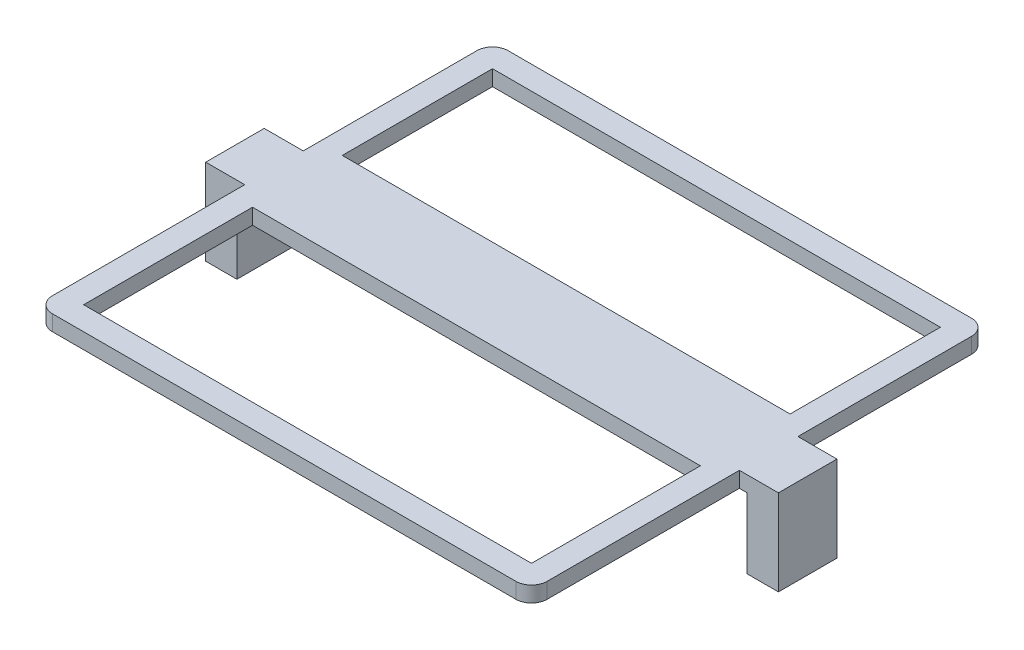
ISO-10303-21;
HEADER;
FILE_DESCRIPTION(('STEP AP214'),'2;1');
FILE_NAME('part.step','',(''),(''),'','','');
FILE_SCHEMA(('AUTOMOTIVE_DESIGN { 1 0 10303 214 1 1 1 1 }'));
ENDSEC;
DATA;
#1=APPLICATION_CONTEXT('core data for automotive mechanical design processes');
#2=APPLICATION_PROTOCOL_DEFINITION('international standard','automotive_design',2000,#1);
#3=PRODUCT_CONTEXT('',#1,'mechanical');
#4=PRODUCT('Part','Part','',(#3));
#5=PRODUCT_RELATED_PRODUCT_CATEGORY('part','',(#4));
#6=PRODUCT_DEFINITION_FORMATION('','',#4);
#7=PRODUCT_DEFINITION_CONTEXT('part definition',#1,'design');
#8=PRODUCT_DEFINITION('design','',#6,#7);
#9=PRODUCT_DEFINITION_SHAPE('','',#8);
#10=(LENGTH_UNIT() NAMED_UNIT(*) SI_UNIT(.MILLI.,.METRE.));
#11=(NAMED_UNIT(*) PLANE_ANGLE_UNIT() SI_UNIT($,.RADIAN.));
#12=(NAMED_UNIT(*) SI_UNIT($,.STERADIAN.) SOLID_ANGLE_UNIT());
#13=UNCERTAINTY_MEASURE_WITH_UNIT(LENGTH_MEASURE(1.E-05),#10,'distance_accuracy_value','');
#14=(GEOMETRIC_REPRESENTATION_CONTEXT(3) GLOBAL_UNCERTAINTY_ASSIGNED_CONTEXT((#13)) GLOBAL_UNIT_ASSIGNED_CONTEXT((#10,
#11,#12)) REPRESENTATION_CONTEXT('',''));
#15=CARTESIAN_POINT('',(0.,0.,0.));
#16=DIRECTION('',(0.,0.,1.));
#17=DIRECTION('',(1.,0.,0.));
#18=AXIS2_PLACEMENT_3D('',#15,#16,#17);
#19=CARTESIAN_POINT('',(0.,0.,0.));
#20=DIRECTION('',(0.,1.,0.));
#21=DIRECTION('',(0.,0.,1.));
#22=AXIS2_PLACEMENT_3D('',#19,#20,#21);
#23=PLANE('',#22);
#24=DIRECTION('',(0.,0.,1.));
#25=VECTOR('',#24,1.);
#26=CARTESIAN_POINT('',(3.,0.,3.));
#27=LINE('',#26,#25);
#28=CARTESIAN_POINT('',(3.,0.,3.));
#29=VERTEX_POINT('',#28);
#30=CARTESIAN_POINT('',(3.,0.,22.255));
#31=VERTEX_POINT('',#30);
#32=EDGE_CURVE('E388',#29,#31,#27,.T.);
#33=ORIENTED_EDGE('',*,*,#32,.T.);
#34=DIRECTION('',(1.,0.,0.));
#35=VECTOR('',#34,1.);
#36=CARTESIAN_POINT('',(3.,0.,22.255));
#37=LINE('',#36,#35);
#38=CARTESIAN_POINT('',(60.4,0.,22.255));
#39=VERTEX_POINT('',#38);
#40=EDGE_CURVE('E385',#31,#39,#37,.T.);
#41=ORIENTED_EDGE('',*,*,#40,.T.);
#42=DIRECTION('',(0.,0.,-1.));
#43=VECTOR('',#42,1.);
#44=CARTESIAN_POINT('',(60.4,0.,3.));
#45=LINE('',#44,#43);
#46=CARTESIAN_POINT('',(60.4,0.,3.));
#47=VERTEX_POINT('',#46);
#48=EDGE_CURVE('E382',#39,#47,#45,.T.);
#49=ORIENTED_EDGE('',*,*,#48,.T.);
#50=DIRECTION('',(-1.,0.,0.));
#51=VECTOR('',#50,1.);
#52=CARTESIAN_POINT('',(3.,0.,3.));
#53=LINE('',#52,#51);
#54=EDGE_CURVE('E378',#47,#29,#53,.T.);
#55=ORIENTED_EDGE('',*,*,#54,.T.);
#56=EDGE_LOOP('',(#33,#41,#49,#55));
#57=FACE_BOUND('',#56,.T.);
#58=DIRECTION('',(0.,0.,1.));
#59=VECTOR('',#58,1.);
#60=CARTESIAN_POINT('',(3.,0.,33.755));
#61=LINE('',#60,#59);
#62=CARTESIAN_POINT('',(3.,0.,33.755));
#63=VERTEX_POINT('',#62);
#64=CARTESIAN_POINT('',(3.00000000000001,0.,55.4));
#65=VERTEX_POINT('',#64);
#66=EDGE_CURVE('E419',#63,#65,#61,.T.);
#67=ORIENTED_EDGE('',*,*,#66,.T.);
#68=DIRECTION('',(1.,0.,0.));
#69=VECTOR('',#68,1.);
#70=CARTESIAN_POINT('',(3.00000000000001,0.,55.4));
#71=LINE('',#70,#69);
#72=CARTESIAN_POINT('',(60.4,0.,55.4));
#73=VERTEX_POINT('',#72);
#74=EDGE_CURVE('E416',#65,#73,#71,.T.);
#75=ORIENTED_EDGE('',*,*,#74,.T.);
#76=DIRECTION('',(0.,0.,-1.));
#77=VECTOR('',#76,1.);
#78=CARTESIAN_POINT('',(60.4,0.,33.755));
#79=LINE('',#78,#77);
#80=CARTESIAN_POINT('',(60.4,0.,33.755));
#81=VERTEX_POINT('',#80);
#82=EDGE_CURVE('E413',#73,#81,#79,.T.);
#83=ORIENTED_EDGE('',*,*,#82,.T.);
#84=DIRECTION('',(-1.,0.,0.));
#85=VECTOR('',#84,1.);
#86=CARTESIAN_POINT('',(3.,0.,33.755));
#87=LINE('',#86,#85);
#88=EDGE_CURVE('E409',#81,#63,#87,.T.);
#89=ORIENTED_EDGE('',*,*,#88,.T.);
#90=EDGE_LOOP('',(#67,#75,#83,#89));
#91=FACE_BOUND('',#90,.T.);
#92=DIRECTION('',(0.,0.,-1.));
#93=VECTOR('',#92,1.);
#94=CARTESIAN_POINT('',(64.4,0.,31.755));
#95=LINE('',#94,#93);
#96=CARTESIAN_POINT('',(64.4,0.,31.755));
#97=VERTEX_POINT('',#96);
#98=CARTESIAN_POINT('',(64.4,0.,24.255));
#99=VERTEX_POINT('',#98);
#100=EDGE_CURVE('E229',#97,#99,#95,.T.);
#101=ORIENTED_EDGE('',*,*,#100,.F.);
#102=DIRECTION('',(1.,0.,0.));
#103=VECTOR('',#102,1.);
#104=CARTESIAN_POINT('',(63.4,0.,31.755));
#105=LINE('',#104,#103);
#106=CARTESIAN_POINT('',(63.4,0.,31.755));
#107=VERTEX_POINT('',#106);
#108=EDGE_CURVE('E238',#107,#97,#105,.T.);
#109=ORIENTED_EDGE('',*,*,#108,.F.);
#110=DIRECTION('',(0.,0.,-1.));
#111=VECTOR('',#110,1.);
#112=CARTESIAN_POINT('',(63.4,0.,31.755));
#113=LINE('',#112,#111);
#114=CARTESIAN_POINT('',(63.4,0.,56.4));
#115=VERTEX_POINT('',#114);
#116=EDGE_CURVE('E248',#115,#107,#113,.T.);
#117=ORIENTED_EDGE('',*,*,#116,.F.);
#118=CARTESIAN_POINT('',(61.4,0.,56.4));
#119=DIRECTION('',(0.,1.,0.));
#120=DIRECTION('',(0.,0.,1.));
#121=AXIS2_PLACEMENT_3D('',#118,#119,#120);
#122=CIRCLE('',#121,2.);
#123=CARTESIAN_POINT('',(61.4,0.,58.4));
#124=VERTEX_POINT('',#123);
#125=EDGE_CURVE('E284',#115,#124,#122,.F.);
#126=ORIENTED_EDGE('',*,*,#125,.T.);
#127=DIRECTION('',(1.,0.,0.));
#128=VECTOR('',#127,1.);
#129=CARTESIAN_POINT('',(0.,0.,58.4));
#130=LINE('',#129,#128);
#131=CARTESIAN_POINT('',(2.00000000000001,0.,58.4));
#132=VERTEX_POINT('',#131);
#133=EDGE_CURVE('E252',#132,#124,#130,.T.);
#134=ORIENTED_EDGE('',*,*,#133,.F.);
#135=CARTESIAN_POINT('',(2.00000000000001,0.,56.4));
#136=DIRECTION('',(0.,1.,0.));
#137=DIRECTION('',(0.,0.,1.));
#138=AXIS2_PLACEMENT_3D('',#135,#136,#137);
#139=CIRCLE('',#138,2.);
#140=CARTESIAN_POINT('',(0.,0.,56.4));
#141=VERTEX_POINT('',#140);
#142=EDGE_CURVE('E286',#132,#141,#139,.F.);
#143=ORIENTED_EDGE('',*,*,#142,.T.);
#144=DIRECTION('',(0.,0.,1.));
#145=VECTOR('',#144,1.);
#146=CARTESIAN_POINT('',(0.,0.,31.755));
#147=LINE('',#146,#145);
#148=CARTESIAN_POINT('',(0.,0.,31.755));
#149=VERTEX_POINT('',#148);
#150=EDGE_CURVE('E319',#149,#141,#147,.T.);
#151=ORIENTED_EDGE('',*,*,#150,.F.);
#152=DIRECTION('',(1.,0.,0.));
#153=VECTOR('',#152,1.);
#154=CARTESIAN_POINT('',(-5.,0.,31.755));
#155=LINE('',#154,#153);
#156=CARTESIAN_POINT('',(-0.999999999999997,0.,31.755));
#157=VERTEX_POINT('',#156);
#158=EDGE_CURVE('E340',#157,#149,#155,.T.);
#159=ORIENTED_EDGE('',*,*,#158,.F.);
#160=DIRECTION('',(0.,0.,1.));
#161=VECTOR('',#160,1.);
#162=CARTESIAN_POINT('',(-0.999999999999997,0.,31.755));
#163=LINE('',#162,#161);
#164=CARTESIAN_POINT('',(-0.999999999999997,0.,24.255));
#165=VERTEX_POINT('',#164);
#166=EDGE_CURVE('E62',#165,#157,#163,.T.);
#167=ORIENTED_EDGE('',*,*,#166,.F.);
#168=DIRECTION('',(-1.,0.,0.));
#169=VECTOR('',#168,1.);
#170=CARTESIAN_POINT('',(-5.,0.,24.255));
#171=LINE('',#170,#169);
#172=CARTESIAN_POINT('',(0.,0.,24.255));
#173=VERTEX_POINT('',#172);
#174=EDGE_CURVE('E344',#173,#165,#171,.T.);
#175=ORIENTED_EDGE('',*,*,#174,.F.);
#176=DIRECTION('',(0.,0.,1.));
#177=VECTOR('',#176,1.);
#178=CARTESIAN_POINT('',(0.,0.,0.));
#179=LINE('',#178,#177);
#180=CARTESIAN_POINT('',(0.,0.,2.));
#181=VERTEX_POINT('',#180);
#182=EDGE_CURVE('E346',#181,#173,#179,.T.);
#183=ORIENTED_EDGE('',*,*,#182,.F.);
#184=CARTESIAN_POINT('',(2.,0.,2.));
#185=DIRECTION('',(0.,1.,0.));
#186=DIRECTION('',(0.,0.,1.));
#187=AXIS2_PLACEMENT_3D('',#184,#185,#186);
#188=CIRCLE('',#187,2.);
#189=CARTESIAN_POINT('',(2.,0.,0.));
#190=VERTEX_POINT('',#189);
#191=EDGE_CURVE('E290',#181,#190,#188,.F.);
#192=ORIENTED_EDGE('',*,*,#191,.T.);
#193=DIRECTION('',(-1.,0.,0.));
#194=VECTOR('',#193,1.);
#195=CARTESIAN_POINT('',(0.,0.,0.));
#196=LINE('',#195,#194);
#197=CARTESIAN_POINT('',(61.4,0.,0.));
#198=VERTEX_POINT('',#197);
#199=EDGE_CURVE('E258',#198,#190,#196,.T.);
#200=ORIENTED_EDGE('',*,*,#199,.F.);
#201=CARTESIAN_POINT('',(61.4,0.,2.));
#202=DIRECTION('',(0.,1.,0.));
#203=DIRECTION('',(0.,0.,1.));
#204=AXIS2_PLACEMENT_3D('',#201,#202,#203);
#205=CIRCLE('',#204,2.);
#206=CARTESIAN_POINT('',(63.4,0.,2.));
#207=VERTEX_POINT('',#206);
#208=EDGE_CURVE('E288',#198,#207,#205,.F.);
#209=ORIENTED_EDGE('',*,*,#208,.T.);
#210=DIRECTION('',(0.,0.,-1.));
#211=VECTOR('',#210,1.);
#212=CARTESIAN_POINT('',(63.4,0.,0.));
#213=LINE('',#212,#211);
#214=CARTESIAN_POINT('',(63.4,0.,24.255));
#215=VERTEX_POINT('',#214);
#216=EDGE_CURVE('E250',#215,#207,#213,.T.);
#217=ORIENTED_EDGE('',*,*,#216,.F.);
#218=DIRECTION('',(-1.,0.,0.));
#219=VECTOR('',#218,1.);
#220=CARTESIAN_POINT('',(63.4,0.,24.255));
#221=LINE('',#220,#219);
#222=EDGE_CURVE('E240',#99,#215,#221,.T.);
#223=ORIENTED_EDGE('',*,*,#222,.F.);
#224=EDGE_LOOP('',(#101,#109,#117,#126,#134,#143,#151,#159,#167,#175,#183,#192,#200,#209,#217,#223));
#225=FACE_BOUND('',#224,.T.);
#226=ADVANCED_FACE('F39',(#57,#91,#225),#23,.F.);
#227=CARTESIAN_POINT('',(0.,2.,0.));
#228=DIRECTION('',(0.,1.,0.));
#229=DIRECTION('',(0.,0.,1.));
#230=AXIS2_PLACEMENT_3D('',#227,#228,#229);
#231=PLANE('',#230);
#232=DIRECTION('',(-1.,0.,0.));
#233=VECTOR('',#232,1.);
#234=CARTESIAN_POINT('',(0.,2.,0.));
#235=LINE('',#234,#233);
#236=CARTESIAN_POINT('',(61.4,2.,0.));
#237=VERTEX_POINT('',#236);
#238=CARTESIAN_POINT('',(2.,2.,0.));
#239=VERTEX_POINT('',#238);
#240=EDGE_CURVE('E266',#237,#239,#235,.T.);
#241=ORIENTED_EDGE('',*,*,#240,.T.);
#242=CARTESIAN_POINT('',(2.,2.,2.));
#243=DIRECTION('',(0.,1.,0.));
#244=DIRECTION('',(0.,0.,1.));
#245=AXIS2_PLACEMENT_3D('',#242,#243,#244);
#246=CIRCLE('',#245,2.);
#247=CARTESIAN_POINT('',(0.,2.,2.));
#248=VERTEX_POINT('',#247);
#249=EDGE_CURVE('E303',#239,#248,#246,.T.);
#250=ORIENTED_EDGE('',*,*,#249,.T.);
#251=DIRECTION('',(0.,0.,1.));
#252=VECTOR('',#251,1.);
#253=CARTESIAN_POINT('',(0.,2.,0.));
#254=LINE('',#253,#252);
#255=CARTESIAN_POINT('',(0.,2.,24.255));
#256=VERTEX_POINT('',#255);
#257=EDGE_CURVE('E261',#248,#256,#254,.T.);
#258=ORIENTED_EDGE('',*,*,#257,.T.);
#259=DIRECTION('',(-1.,0.,0.));
#260=VECTOR('',#259,1.);
#261=CARTESIAN_POINT('',(-5.,2.,24.255));
#262=LINE('',#261,#260);
#263=CARTESIAN_POINT('',(-5.,2.,24.255));
#264=VERTEX_POINT('',#263);
#265=EDGE_CURVE('E365',#256,#264,#262,.T.);
#266=ORIENTED_EDGE('',*,*,#265,.T.);
#267=DIRECTION('',(0.,0.,1.));
#268=VECTOR('',#267,1.);
#269=CARTESIAN_POINT('',(-5.,2.,24.255));
#270=LINE('',#269,#268);
#271=CARTESIAN_POINT('',(-5.,2.,31.755));
#272=VERTEX_POINT('',#271);
#273=EDGE_CURVE('E363',#264,#272,#270,.T.);
#274=ORIENTED_EDGE('',*,*,#273,.T.);
#275=DIRECTION('',(1.,0.,0.));
#276=VECTOR('',#275,1.);
#277=CARTESIAN_POINT('',(-5.,2.,31.755));
#278=LINE('',#277,#276);
#279=CARTESIAN_POINT('',(0.,2.,31.755));
#280=VERTEX_POINT('',#279);
#281=EDGE_CURVE('E329',#272,#280,#278,.T.);
#282=ORIENTED_EDGE('',*,*,#281,.T.);
#283=DIRECTION('',(0.,0.,1.));
#284=VECTOR('',#283,1.);
#285=CARTESIAN_POINT('',(0.,2.,31.755));
#286=LINE('',#285,#284);
#287=CARTESIAN_POINT('',(0.,2.,56.4));
#288=VERTEX_POINT('',#287);
#289=EDGE_CURVE('E317',#280,#288,#286,.T.);
#290=ORIENTED_EDGE('',*,*,#289,.T.);
#291=CARTESIAN_POINT('',(2.00000000000001,2.,56.4));
#292=DIRECTION('',(0.,1.,0.));
#293=DIRECTION('',(0.,0.,1.));
#294=AXIS2_PLACEMENT_3D('',#291,#292,#293);
#295=CIRCLE('',#294,2.);
#296=CARTESIAN_POINT('',(2.00000000000001,2.,58.4));
#297=VERTEX_POINT('',#296);
#298=EDGE_CURVE('E299',#288,#297,#295,.T.);
#299=ORIENTED_EDGE('',*,*,#298,.T.);
#300=DIRECTION('',(1.,0.,0.));
#301=VECTOR('',#300,1.);
#302=CARTESIAN_POINT('',(0.,2.,58.4));
#303=LINE('',#302,#301);
#304=CARTESIAN_POINT('',(61.4,2.,58.4));
#305=VERTEX_POINT('',#304);
#306=EDGE_CURVE('E331',#297,#305,#303,.T.);
#307=ORIENTED_EDGE('',*,*,#306,.T.);
#308=CARTESIAN_POINT('',(61.4,2.,56.4));
#309=DIRECTION('',(0.,1.,0.));
#310=DIRECTION('',(0.,0.,1.));
#311=AXIS2_PLACEMENT_3D('',#308,#309,#310);
#312=CIRCLE('',#311,2.);
#313=CARTESIAN_POINT('',(63.4,2.,56.4));
#314=VERTEX_POINT('',#313);
#315=EDGE_CURVE('E297',#305,#314,#312,.T.);
#316=ORIENTED_EDGE('',*,*,#315,.T.);
#317=DIRECTION('',(0.,0.,-1.));
#318=VECTOR('',#317,1.);
#319=CARTESIAN_POINT('',(63.4,2.,31.755));
#320=LINE('',#319,#318);
#321=CARTESIAN_POINT('',(63.4,2.,31.755));
#322=VERTEX_POINT('',#321);
#323=EDGE_CURVE('E359',#314,#322,#320,.T.);
#324=ORIENTED_EDGE('',*,*,#323,.T.);
#325=DIRECTION('',(1.,0.,0.));
#326=VECTOR('',#325,1.);
#327=CARTESIAN_POINT('',(63.4,2.,31.755));
#328=LINE('',#327,#326);
#329=CARTESIAN_POINT('',(68.4,2.,31.755));
#330=VERTEX_POINT('',#329);
#331=EDGE_CURVE('E357',#322,#330,#328,.T.);
#332=ORIENTED_EDGE('',*,*,#331,.T.);
#333=DIRECTION('',(0.,0.,-1.));
#334=VECTOR('',#333,1.);
#335=CARTESIAN_POINT('',(68.4,2.,24.255));
#336=LINE('',#335,#334);
#337=CARTESIAN_POINT('',(68.4,2.,24.255));
#338=VERTEX_POINT('',#337);
#339=EDGE_CURVE('E355',#330,#338,#336,.T.);
#340=ORIENTED_EDGE('',*,*,#339,.T.);
#341=DIRECTION('',(-1.,0.,0.));
#342=VECTOR('',#341,1.);
#343=CARTESIAN_POINT('',(63.4,2.,24.255));
#344=LINE('',#343,#342);
#345=CARTESIAN_POINT('',(63.4,2.,24.255));
#346=VERTEX_POINT('',#345);
#347=EDGE_CURVE('E353',#338,#346,#344,.T.);
#348=ORIENTED_EDGE('',*,*,#347,.T.);
#349=DIRECTION('',(0.,0.,-1.));
#350=VECTOR('',#349,1.);
#351=CARTESIAN_POINT('',(63.4,2.,0.));
#352=LINE('',#351,#350);
#353=CARTESIAN_POINT('',(63.4,2.,2.));
#354=VERTEX_POINT('',#353);
#355=EDGE_CURVE('E350',#346,#354,#352,.T.);
#356=ORIENTED_EDGE('',*,*,#355,.T.);
#357=CARTESIAN_POINT('',(61.4,2.,2.));
#358=DIRECTION('',(0.,1.,0.));
#359=DIRECTION('',(0.,0.,1.));
#360=AXIS2_PLACEMENT_3D('',#357,#358,#359);
#361=CIRCLE('',#360,2.);
#362=EDGE_CURVE('E301',#354,#237,#361,.T.);
#363=ORIENTED_EDGE('',*,*,#362,.T.);
#364=EDGE_LOOP('',(#241,#250,#258,#266,#274,#282,#290,#299,#307,#316,#324,#332,#340,#348,#356,#363));
#365=FACE_BOUND('',#364,.T.);
#366=DIRECTION('',(1.,0.,0.));
#367=VECTOR('',#366,1.);
#368=CARTESIAN_POINT('',(3.,2.,22.255));
#369=LINE('',#368,#367);
#370=CARTESIAN_POINT('',(3.,2.,22.255));
#371=VERTEX_POINT('',#370);
#372=CARTESIAN_POINT('',(60.4,2.,22.255));
#373=VERTEX_POINT('',#372);
#374=EDGE_CURVE('E396',#371,#373,#369,.T.);
#375=ORIENTED_EDGE('',*,*,#374,.F.);
#376=DIRECTION('',(0.,0.,1.));
#377=VECTOR('',#376,1.);
#378=CARTESIAN_POINT('',(3.,2.,3.));
#379=LINE('',#378,#377);
#380=CARTESIAN_POINT('',(3.,2.,3.));
#381=VERTEX_POINT('',#380);
#382=EDGE_CURVE('E381',#381,#371,#379,.T.);
#383=ORIENTED_EDGE('',*,*,#382,.F.);
#384=DIRECTION('',(-1.,0.,0.));
#385=VECTOR('',#384,1.);
#386=CARTESIAN_POINT('',(3.,2.,3.));
#387=LINE('',#386,#385);
#388=CARTESIAN_POINT('',(60.4,2.,3.));
#389=VERTEX_POINT('',#388);
#390=EDGE_CURVE('E377',#389,#381,#387,.T.);
#391=ORIENTED_EDGE('',*,*,#390,.F.);
#392=DIRECTION('',(0.,0.,-1.));
#393=VECTOR('',#392,1.);
#394=CARTESIAN_POINT('',(60.4,2.,3.));
#395=LINE('',#394,#393);
#396=EDGE_CURVE('E393',#373,#389,#395,.T.);
#397=ORIENTED_EDGE('',*,*,#396,.F.);
#398=EDGE_LOOP('',(#375,#383,#391,#397));
#399=FACE_BOUND('',#398,.T.);
#400=DIRECTION('',(1.,0.,0.));
#401=VECTOR('',#400,1.);
#402=CARTESIAN_POINT('',(3.00000000000001,2.,55.4));
#403=LINE('',#402,#401);
#404=CARTESIAN_POINT('',(3.00000000000001,2.,55.4));
#405=VERTEX_POINT('',#404);
#406=CARTESIAN_POINT('',(60.4,2.,55.4));
#407=VERTEX_POINT('',#406);
#408=EDGE_CURVE('E427',#405,#407,#403,.T.);
#409=ORIENTED_EDGE('',*,*,#408,.F.);
#410=DIRECTION('',(0.,0.,1.));
#411=VECTOR('',#410,1.);
#412=CARTESIAN_POINT('',(3.,2.,33.755));
#413=LINE('',#412,#411);
#414=CARTESIAN_POINT('',(3.,2.,33.755));
#415=VERTEX_POINT('',#414);
#416=EDGE_CURVE('E412',#415,#405,#413,.T.);
#417=ORIENTED_EDGE('',*,*,#416,.F.);
#418=DIRECTION('',(-1.,0.,0.));
#419=VECTOR('',#418,1.);
#420=CARTESIAN_POINT('',(3.,2.,33.755));
#421=LINE('',#420,#419);
#422=CARTESIAN_POINT('',(60.4,2.,33.755));
#423=VERTEX_POINT('',#422);
#424=EDGE_CURVE('E408',#423,#415,#421,.T.);
#425=ORIENTED_EDGE('',*,*,#424,.F.);
#426=DIRECTION('',(0.,0.,-1.));
#427=VECTOR('',#426,1.);
#428=CARTESIAN_POINT('',(60.4,2.,33.755));
#429=LINE('',#428,#427);
#430=EDGE_CURVE('E424',#407,#423,#429,.T.);
#431=ORIENTED_EDGE('',*,*,#430,.F.);
#432=EDGE_LOOP('',(#409,#417,#425,#431));
#433=FACE_BOUND('',#432,.T.);
#434=ADVANCED_FACE('F324',(#365,#399,#433),#231,.T.);
#435=CARTESIAN_POINT('',(0.,2.,0.));
#436=DIRECTION('',(1.,0.,0.));
#437=DIRECTION('',(0.,0.,-1.));
#438=AXIS2_PLACEMENT_3D('',#435,#436,#437);
#439=PLANE('',#438);
#440=ORIENTED_EDGE('',*,*,#257,.F.);
#441=DIRECTION('',(0.,-1.,0.));
#442=VECTOR('',#441,1.);
#443=CARTESIAN_POINT('',(0.,2.,2.));
#444=LINE('',#443,#442);
#445=EDGE_CURVE('E281',#248,#181,#444,.T.);
#446=ORIENTED_EDGE('',*,*,#445,.T.);
#447=ORIENTED_EDGE('',*,*,#182,.T.);
#448=DIRECTION('',(0.,-1.,0.));
#449=VECTOR('',#448,1.);
#450=CARTESIAN_POINT('',(0.,2.,24.255));
#451=LINE('',#450,#449);
#452=EDGE_CURVE('E278',#256,#173,#451,.T.);
#453=ORIENTED_EDGE('',*,*,#452,.F.);
#454=EDGE_LOOP('',(#440,#446,#447,#453));
#455=FACE_BOUND('',#454,.T.);
#456=ADVANCED_FACE('F485',(#455),#439,.F.);
#457=CARTESIAN_POINT('',(-5.,2.,24.255));
#458=DIRECTION('',(0.,0.,1.));
#459=DIRECTION('',(1.,0.,0.));
#460=AXIS2_PLACEMENT_3D('',#457,#458,#459);
#461=PLANE('',#460);
#462=ORIENTED_EDGE('',*,*,#174,.T.);
#463=DIRECTION('',(0.,1.,0.));
#464=VECTOR('',#463,1.);
#465=CARTESIAN_POINT('',(-0.999999999999997,-9.,24.255));
#466=LINE('',#465,#464);
#467=CARTESIAN_POINT('',(-0.999999999999997,-9.,24.255));
#468=VERTEX_POINT('',#467);
#469=EDGE_CURVE('E422',#468,#165,#466,.T.);
#470=ORIENTED_EDGE('',*,*,#469,.F.);
#471=DIRECTION('',(1.,0.,0.));
#472=VECTOR('',#471,1.);
#473=CARTESIAN_POINT('',(-5.,-9.,24.255));
#474=LINE('',#473,#472);
#475=CARTESIAN_POINT('',(-5.,-9.,24.255));
#476=VERTEX_POINT('',#475);
#477=EDGE_CURVE('E442',#476,#468,#474,.T.);
#478=ORIENTED_EDGE('',*,*,#477,.F.);
#479=DIRECTION('',(0.,-1.,0.));
#480=VECTOR('',#479,1.);
#481=CARTESIAN_POINT('',(-5.,2.,24.255));
#482=LINE('',#481,#480);
#483=EDGE_CURVE('E276',#264,#476,#482,.T.);
#484=ORIENTED_EDGE('',*,*,#483,.F.);
#485=ORIENTED_EDGE('',*,*,#265,.F.);
#486=ORIENTED_EDGE('',*,*,#452,.T.);
#487=EDGE_LOOP('',(#462,#470,#478,#484,#485,#486));
#488=FACE_BOUND('',#487,.T.);
#489=ADVANCED_FACE('F519',(#488),#461,.F.);
#490=CARTESIAN_POINT('',(-5.,2.,24.255));
#491=DIRECTION('',(1.,0.,0.));
#492=DIRECTION('',(0.,0.,-1.));
#493=AXIS2_PLACEMENT_3D('',#490,#491,#492);
#494=PLANE('',#493);
#495=ORIENTED_EDGE('',*,*,#483,.T.);
#496=DIRECTION('',(0.,0.,-1.));
#497=VECTOR('',#496,1.);
#498=CARTESIAN_POINT('',(-5.,-9.,31.755));
#499=LINE('',#498,#497);
#500=CARTESIAN_POINT('',(-5.,-9.,31.755));
#501=VERTEX_POINT('',#500);
#502=EDGE_CURVE('E437',#501,#476,#499,.T.);
#503=ORIENTED_EDGE('',*,*,#502,.F.);
#504=DIRECTION('',(0.,-1.,0.));
#505=VECTOR('',#504,1.);
#506=CARTESIAN_POINT('',(-5.,2.,31.755));
#507=LINE('',#506,#505);
#508=EDGE_CURVE('E274',#272,#501,#507,.T.);
#509=ORIENTED_EDGE('',*,*,#508,.F.);
#510=ORIENTED_EDGE('',*,*,#273,.F.);
#511=EDGE_LOOP('',(#495,#503,#509,#510));
#512=FACE_BOUND('',#511,.T.);
#513=ADVANCED_FACE('F515',(#512),#494,.F.);
#514=CARTESIAN_POINT('',(-5.,2.,31.755));
#515=DIRECTION('',(0.,0.,-1.));
#516=DIRECTION('',(-1.,0.,0.));
#517=AXIS2_PLACEMENT_3D('',#514,#515,#516);
#518=PLANE('',#517);
#519=ORIENTED_EDGE('',*,*,#508,.T.);
#520=DIRECTION('',(-1.,0.,0.));
#521=VECTOR('',#520,1.);
#522=CARTESIAN_POINT('',(-5.,-9.,31.755));
#523=LINE('',#522,#521);
#524=CARTESIAN_POINT('',(-0.999999999999997,-9.,31.755));
#525=VERTEX_POINT('',#524);
#526=EDGE_CURVE('E435',#525,#501,#523,.T.);
#527=ORIENTED_EDGE('',*,*,#526,.F.);
#528=DIRECTION('',(0.,1.,0.));
#529=VECTOR('',#528,1.);
#530=CARTESIAN_POINT('',(-0.999999999999997,-9.,31.755));
#531=LINE('',#530,#529);
#532=EDGE_CURVE('E432',#525,#157,#531,.T.);
#533=ORIENTED_EDGE('',*,*,#532,.T.);
#534=ORIENTED_EDGE('',*,*,#158,.T.);
#535=DIRECTION('',(0.,-1.,0.));
#536=VECTOR('',#535,1.);
#537=CARTESIAN_POINT('',(0.,2.,31.755));
#538=LINE('',#537,#536);
#539=EDGE_CURVE('E271',#280,#149,#538,.T.);
#540=ORIENTED_EDGE('',*,*,#539,.F.);
#541=ORIENTED_EDGE('',*,*,#281,.F.);
#542=EDGE_LOOP('',(#519,#527,#533,#534,#540,#541));
#543=FACE_BOUND('',#542,.T.);
#544=ADVANCED_FACE('F512',(#543),#518,.F.);
#545=CARTESIAN_POINT('',(0.,2.,31.755));
#546=DIRECTION('',(1.,0.,0.));
#547=DIRECTION('',(0.,0.,-1.));
#548=AXIS2_PLACEMENT_3D('',#545,#546,#547);
#549=PLANE('',#548);
#550=ORIENTED_EDGE('',*,*,#150,.T.);
#551=DIRECTION('',(0.,-1.,0.));
#552=VECTOR('',#551,1.);
#553=CARTESIAN_POINT('',(0.,2.,56.4));
#554=LINE('',#553,#552);
#555=EDGE_CURVE('E47',#141,#288,#554,.F.);
#556=ORIENTED_EDGE('',*,*,#555,.T.);
#557=ORIENTED_EDGE('',*,*,#289,.F.);
#558=ORIENTED_EDGE('',*,*,#539,.T.);
#559=EDGE_LOOP('',(#550,#556,#557,#558));
#560=FACE_BOUND('',#559,.T.);
#561=ADVANCED_FACE('F316',(#560),#549,.F.);
#562=CARTESIAN_POINT('',(0.,2.,58.4));
#563=DIRECTION('',(0.,0.,-1.));
#564=DIRECTION('',(-1.,0.,0.));
#565=AXIS2_PLACEMENT_3D('',#562,#563,#564);
#566=PLANE('',#565);
#567=ORIENTED_EDGE('',*,*,#306,.F.);
#568=DIRECTION('',(0.,-1.,0.));
#569=VECTOR('',#568,1.);
#570=CARTESIAN_POINT('',(2.00000000000001,2.,58.4));
#571=LINE('',#570,#569);
#572=EDGE_CURVE('E309',#297,#132,#571,.T.);
#573=ORIENTED_EDGE('',*,*,#572,.T.);
#574=ORIENTED_EDGE('',*,*,#133,.T.);
#575=DIRECTION('',(0.,-1.,0.));
#576=VECTOR('',#575,1.);
#577=CARTESIAN_POINT('',(61.4,2.,58.4));
#578=LINE('',#577,#576);
#579=EDGE_CURVE('E307',#124,#305,#578,.F.);
#580=ORIENTED_EDGE('',*,*,#579,.T.);
#581=EDGE_LOOP('',(#567,#573,#574,#580));
#582=FACE_BOUND('',#581,.T.);
#583=ADVANCED_FACE('F338',(#582),#566,.F.);
#584=CARTESIAN_POINT('',(63.4,2.,31.755));
#585=DIRECTION('',(-1.,0.,0.));
#586=DIRECTION('',(0.,0.,1.));
#587=AXIS2_PLACEMENT_3D('',#584,#585,#586);
#588=PLANE('',#587);
#589=ORIENTED_EDGE('',*,*,#323,.F.);
#590=DIRECTION('',(0.,-1.,0.));
#591=VECTOR('',#590,1.);
#592=CARTESIAN_POINT('',(63.4,2.,56.4));
#593=LINE('',#592,#591);
#594=EDGE_CURVE('E11',#314,#115,#593,.T.);
#595=ORIENTED_EDGE('',*,*,#594,.T.);
#596=ORIENTED_EDGE('',*,*,#116,.T.);
#597=DIRECTION('',(0.,-1.,0.));
#598=VECTOR('',#597,1.);
#599=CARTESIAN_POINT('',(63.4,2.,31.755));
#600=LINE('',#599,#598);
#601=EDGE_CURVE('E247',#322,#107,#600,.T.);
#602=ORIENTED_EDGE('',*,*,#601,.F.);
#603=EDGE_LOOP('',(#589,#595,#596,#602));
#604=FACE_BOUND('',#603,.T.);
#605=ADVANCED_FACE('F467',(#604),#588,.F.);
#606=CARTESIAN_POINT('',(63.4,2.,31.755));
#607=DIRECTION('',(0.,0.,-1.));
#608=DIRECTION('',(-1.,0.,0.));
#609=AXIS2_PLACEMENT_3D('',#606,#607,#608);
#610=PLANE('',#609);
#611=ORIENTED_EDGE('',*,*,#108,.T.);
#612=DIRECTION('',(0.,1.,0.));
#613=VECTOR('',#612,1.);
#614=CARTESIAN_POINT('',(64.4,-9.,31.755));
#615=LINE('',#614,#613);
#616=CARTESIAN_POINT('',(64.4,-9.,31.755));
#617=VERTEX_POINT('',#616);
#618=EDGE_CURVE('E226',#617,#97,#615,.T.);
#619=ORIENTED_EDGE('',*,*,#618,.F.);
#620=DIRECTION('',(-1.,0.,0.));
#621=VECTOR('',#620,1.);
#622=CARTESIAN_POINT('',(68.4,-9.,31.755));
#623=LINE('',#622,#621);
#624=CARTESIAN_POINT('',(68.4,-9.,31.755));
#625=VERTEX_POINT('',#624);
#626=EDGE_CURVE('E448',#625,#617,#623,.T.);
#627=ORIENTED_EDGE('',*,*,#626,.F.);
#628=DIRECTION('',(0.,-1.,0.));
#629=VECTOR('',#628,1.);
#630=CARTESIAN_POINT('',(68.4,2.,31.755));
#631=LINE('',#630,#629);
#632=EDGE_CURVE('E268',#330,#625,#631,.T.);
#633=ORIENTED_EDGE('',*,*,#632,.F.);
#634=ORIENTED_EDGE('',*,*,#331,.F.);
#635=ORIENTED_EDGE('',*,*,#601,.T.);
#636=EDGE_LOOP('',(#611,#619,#627,#633,#634,#635));
#637=FACE_BOUND('',#636,.T.);
#638=ADVANCED_FACE('F244',(#637),#610,.F.);
#639=CARTESIAN_POINT('',(68.4,2.,24.255));
#640=DIRECTION('',(-1.,0.,0.));
#641=DIRECTION('',(0.,0.,1.));
#642=AXIS2_PLACEMENT_3D('',#639,#640,#641);
#643=PLANE('',#642);
#644=ORIENTED_EDGE('',*,*,#632,.T.);
#645=DIRECTION('',(0.,0.,1.));
#646=VECTOR('',#645,1.);
#647=CARTESIAN_POINT('',(68.4,-9.,31.755));
#648=LINE('',#647,#646);
#649=CARTESIAN_POINT('',(68.4,-9.,24.255));
#650=VERTEX_POINT('',#649);
#651=EDGE_CURVE('E241',#650,#625,#648,.T.);
#652=ORIENTED_EDGE('',*,*,#651,.F.);
#653=DIRECTION('',(0.,-1.,0.));
#654=VECTOR('',#653,1.);
#655=CARTESIAN_POINT('',(68.4,2.,24.255));
#656=LINE('',#655,#654);
#657=EDGE_CURVE('E265',#338,#650,#656,.T.);
#658=ORIENTED_EDGE('',*,*,#657,.F.);
#659=ORIENTED_EDGE('',*,*,#339,.F.);
#660=EDGE_LOOP('',(#644,#652,#658,#659));
#661=FACE_BOUND('',#660,.T.);
#662=ADVANCED_FACE('F459',(#661),#643,.F.);
#663=CARTESIAN_POINT('',(63.4,2.,24.255));
#664=DIRECTION('',(0.,0.,1.));
#665=DIRECTION('',(1.,0.,0.));
#666=AXIS2_PLACEMENT_3D('',#663,#664,#665);
#667=PLANE('',#666);
#668=ORIENTED_EDGE('',*,*,#657,.T.);
#669=DIRECTION('',(1.,0.,0.));
#670=VECTOR('',#669,1.);
#671=CARTESIAN_POINT('',(68.4,-9.,24.255));
#672=LINE('',#671,#670);
#673=CARTESIAN_POINT('',(64.4,-9.,24.255));
#674=VERTEX_POINT('',#673);
#675=EDGE_CURVE('E451',#674,#650,#672,.T.);
#676=ORIENTED_EDGE('',*,*,#675,.F.);
#677=DIRECTION('',(0.,1.,0.));
#678=VECTOR('',#677,1.);
#679=CARTESIAN_POINT('',(64.4,-9.,24.255));
#680=LINE('',#679,#678);
#681=EDGE_CURVE('E54',#674,#99,#680,.T.);
#682=ORIENTED_EDGE('',*,*,#681,.T.);
#683=ORIENTED_EDGE('',*,*,#222,.T.);
#684=DIRECTION('',(0.,-1.,0.));
#685=VECTOR('',#684,1.);
#686=CARTESIAN_POINT('',(63.4,2.,24.255));
#687=LINE('',#686,#685);
#688=EDGE_CURVE('E262',#346,#215,#687,.T.);
#689=ORIENTED_EDGE('',*,*,#688,.F.);
#690=ORIENTED_EDGE('',*,*,#347,.F.);
#691=EDGE_LOOP('',(#668,#676,#682,#683,#689,#690));
#692=FACE_BOUND('',#691,.T.);
#693=ADVANCED_FACE('F498',(#692),#667,.F.);
#694=CARTESIAN_POINT('',(63.4,2.,0.));
#695=DIRECTION('',(-1.,0.,0.));
#696=DIRECTION('',(0.,0.,1.));
#697=AXIS2_PLACEMENT_3D('',#694,#695,#696);
#698=PLANE('',#697);
#699=ORIENTED_EDGE('',*,*,#216,.T.);
#700=DIRECTION('',(0.,-1.,0.));
#701=VECTOR('',#700,1.);
#702=CARTESIAN_POINT('',(63.4,2.,2.));
#703=LINE('',#702,#701);
#704=EDGE_CURVE('E305',#207,#354,#703,.F.);
#705=ORIENTED_EDGE('',*,*,#704,.T.);
#706=ORIENTED_EDGE('',*,*,#355,.F.);
#707=ORIENTED_EDGE('',*,*,#688,.T.);
#708=EDGE_LOOP('',(#699,#705,#706,#707));
#709=FACE_BOUND('',#708,.T.);
#710=ADVANCED_FACE('F494',(#709),#698,.F.);
#711=CARTESIAN_POINT('',(0.,2.,0.));
#712=DIRECTION('',(0.,0.,1.));
#713=DIRECTION('',(1.,0.,0.));
#714=AXIS2_PLACEMENT_3D('',#711,#712,#713);
#715=PLANE('',#714);
#716=ORIENTED_EDGE('',*,*,#199,.T.);
#717=DIRECTION('',(0.,-1.,0.));
#718=VECTOR('',#717,1.);
#719=CARTESIAN_POINT('',(2.,2.,0.));
#720=LINE('',#719,#718);
#721=EDGE_CURVE('E295',#190,#239,#720,.F.);
#722=ORIENTED_EDGE('',*,*,#721,.T.);
#723=ORIENTED_EDGE('',*,*,#240,.F.);
#724=DIRECTION('',(0.,-1.,0.));
#725=VECTOR('',#724,1.);
#726=CARTESIAN_POINT('',(61.4,2.,0.));
#727=LINE('',#726,#725);
#728=EDGE_CURVE('E292',#237,#198,#727,.T.);
#729=ORIENTED_EDGE('',*,*,#728,.T.);
#730=EDGE_LOOP('',(#716,#722,#723,#729));
#731=FACE_BOUND('',#730,.T.);
#732=ADVANCED_FACE('F490',(#731),#715,.F.);
#733=CARTESIAN_POINT('',(3.,2.,3.));
#734=DIRECTION('',(1.,0.,0.));
#735=DIRECTION('',(0.,0.,-1.));
#736=AXIS2_PLACEMENT_3D('',#733,#734,#735);
#737=PLANE('',#736);
#738=ORIENTED_EDGE('',*,*,#32,.F.);
#739=DIRECTION('',(0.,-1.,0.));
#740=VECTOR('',#739,1.);
#741=CARTESIAN_POINT('',(3.,2.,3.));
#742=LINE('',#741,#740);
#743=EDGE_CURVE('E374',#381,#29,#742,.T.);
#744=ORIENTED_EDGE('',*,*,#743,.F.);
#745=ORIENTED_EDGE('',*,*,#382,.T.);
#746=DIRECTION('',(0.,-1.,0.));
#747=VECTOR('',#746,1.);
#748=CARTESIAN_POINT('',(3.,2.,22.255));
#749=LINE('',#748,#747);
#750=EDGE_CURVE('E348',#371,#31,#749,.T.);
#751=ORIENTED_EDGE('',*,*,#750,.T.);
#752=EDGE_LOOP('',(#738,#744,#745,#751));
#753=FACE_BOUND('',#752,.T.);
#754=ADVANCED_FACE('F493',(#753),#737,.T.);
#755=CARTESIAN_POINT('',(3.,2.,22.255));
#756=DIRECTION('',(0.,0.,-1.));
#757=DIRECTION('',(-1.,0.,0.));
#758=AXIS2_PLACEMENT_3D('',#755,#756,#757);
#759=PLANE('',#758);
#760=ORIENTED_EDGE('',*,*,#40,.F.);
#761=ORIENTED_EDGE('',*,*,#750,.F.);
#762=ORIENTED_EDGE('',*,*,#374,.T.);
#763=DIRECTION('',(0.,-1.,0.));
#764=VECTOR('',#763,1.);
#765=CARTESIAN_POINT('',(60.4,2.,22.255));
#766=LINE('',#765,#764);
#767=EDGE_CURVE('E370',#373,#39,#766,.T.);
#768=ORIENTED_EDGE('',*,*,#767,.T.);
#769=EDGE_LOOP('',(#760,#761,#762,#768));
#770=FACE_BOUND('',#769,.T.);
#771=ADVANCED_FACE('F589',(#770),#759,.T.);
#772=CARTESIAN_POINT('',(60.4,2.,3.));
#773=DIRECTION('',(-1.,0.,0.));
#774=DIRECTION('',(0.,0.,1.));
#775=AXIS2_PLACEMENT_3D('',#772,#773,#774);
#776=PLANE('',#775);
#777=ORIENTED_EDGE('',*,*,#48,.F.);
#778=ORIENTED_EDGE('',*,*,#767,.F.);
#779=ORIENTED_EDGE('',*,*,#396,.T.);
#780=DIRECTION('',(0.,-1.,0.));
#781=VECTOR('',#780,1.);
#782=CARTESIAN_POINT('',(60.4,2.,3.));
#783=LINE('',#782,#781);
#784=EDGE_CURVE('E372',#389,#47,#783,.T.);
#785=ORIENTED_EDGE('',*,*,#784,.T.);
#786=EDGE_LOOP('',(#777,#778,#779,#785));
#787=FACE_BOUND('',#786,.T.);
#788=ADVANCED_FACE('F585',(#787),#776,.T.);
#789=CARTESIAN_POINT('',(3.,2.,3.));
#790=DIRECTION('',(0.,0.,1.));
#791=DIRECTION('',(1.,0.,0.));
#792=AXIS2_PLACEMENT_3D('',#789,#790,#791);
#793=PLANE('',#792);
#794=ORIENTED_EDGE('',*,*,#54,.F.);
#795=ORIENTED_EDGE('',*,*,#784,.F.);
#796=ORIENTED_EDGE('',*,*,#390,.T.);
#797=ORIENTED_EDGE('',*,*,#743,.T.);
#798=EDGE_LOOP('',(#794,#795,#796,#797));
#799=FACE_BOUND('',#798,.T.);
#800=ADVANCED_FACE('F581',(#799),#793,.T.);
#801=CARTESIAN_POINT('',(3.,2.,33.755));
#802=DIRECTION('',(1.,0.,0.));
#803=DIRECTION('',(0.,0.,-1.));
#804=AXIS2_PLACEMENT_3D('',#801,#802,#803);
#805=PLANE('',#804);
#806=ORIENTED_EDGE('',*,*,#66,.F.);
#807=DIRECTION('',(0.,-1.,0.));
#808=VECTOR('',#807,1.);
#809=CARTESIAN_POINT('',(3.,2.,33.755));
#810=LINE('',#809,#808);
#811=EDGE_CURVE('E405',#415,#63,#810,.T.);
#812=ORIENTED_EDGE('',*,*,#811,.F.);
#813=ORIENTED_EDGE('',*,*,#416,.T.);
#814=DIRECTION('',(0.,-1.,0.));
#815=VECTOR('',#814,1.);
#816=CARTESIAN_POINT('',(3.00000000000001,2.,55.4));
#817=LINE('',#816,#815);
#818=EDGE_CURVE('E391',#405,#65,#817,.T.);
#819=ORIENTED_EDGE('',*,*,#818,.T.);
#820=EDGE_LOOP('',(#806,#812,#813,#819));
#821=FACE_BOUND('',#820,.T.);
#822=ADVANCED_FACE('F577',(#821),#805,.T.);
#823=CARTESIAN_POINT('',(3.00000000000001,2.,55.4));
#824=DIRECTION('',(0.,0.,-1.));
#825=DIRECTION('',(-1.,0.,0.));
#826=AXIS2_PLACEMENT_3D('',#823,#824,#825);
#827=PLANE('',#826);
#828=ORIENTED_EDGE('',*,*,#74,.F.);
#829=ORIENTED_EDGE('',*,*,#818,.F.);
#830=ORIENTED_EDGE('',*,*,#408,.T.);
#831=DIRECTION('',(0.,-1.,0.));
#832=VECTOR('',#831,1.);
#833=CARTESIAN_POINT('',(60.4,2.,55.4));
#834=LINE('',#833,#832);
#835=EDGE_CURVE('E401',#407,#73,#834,.T.);
#836=ORIENTED_EDGE('',*,*,#835,.T.);
#837=EDGE_LOOP('',(#828,#829,#830,#836));
#838=FACE_BOUND('',#837,.T.);
#839=ADVANCED_FACE('F573',(#838),#827,.T.);
#840=CARTESIAN_POINT('',(60.4,2.,33.755));
#841=DIRECTION('',(-1.,0.,0.));
#842=DIRECTION('',(0.,0.,1.));
#843=AXIS2_PLACEMENT_3D('',#840,#841,#842);
#844=PLANE('',#843);
#845=ORIENTED_EDGE('',*,*,#82,.F.);
#846=ORIENTED_EDGE('',*,*,#835,.F.);
#847=ORIENTED_EDGE('',*,*,#430,.T.);
#848=DIRECTION('',(0.,-1.,0.));
#849=VECTOR('',#848,1.);
#850=CARTESIAN_POINT('',(60.4,2.,33.755));
#851=LINE('',#850,#849);
#852=EDGE_CURVE('E403',#423,#81,#851,.T.);
#853=ORIENTED_EDGE('',*,*,#852,.T.);
#854=EDGE_LOOP('',(#845,#846,#847,#853));
#855=FACE_BOUND('',#854,.T.);
#856=ADVANCED_FACE('F569',(#855),#844,.T.);
#857=CARTESIAN_POINT('',(3.,2.,33.755));
#858=DIRECTION('',(0.,0.,1.));
#859=DIRECTION('',(1.,0.,0.));
#860=AXIS2_PLACEMENT_3D('',#857,#858,#859);
#861=PLANE('',#860);
#862=ORIENTED_EDGE('',*,*,#88,.F.);
#863=ORIENTED_EDGE('',*,*,#852,.F.);
#864=ORIENTED_EDGE('',*,*,#424,.T.);
#865=ORIENTED_EDGE('',*,*,#811,.T.);
#866=EDGE_LOOP('',(#862,#863,#864,#865));
#867=FACE_BOUND('',#866,.T.);
#868=ADVANCED_FACE('F530',(#867),#861,.T.);
#869=CARTESIAN_POINT('',(2.,2.,2.));
#870=DIRECTION('',(0.,-1.,0.));
#871=DIRECTION('',(0.,0.,-1.));
#872=AXIS2_PLACEMENT_3D('',#869,#870,#871);
#873=CYLINDRICAL_SURFACE('',#872,2.);
#874=ORIENTED_EDGE('',*,*,#249,.F.);
#875=ORIENTED_EDGE('',*,*,#721,.F.);
#876=ORIENTED_EDGE('',*,*,#191,.F.);
#877=ORIENTED_EDGE('',*,*,#445,.F.);
#878=EDGE_LOOP('',(#874,#875,#876,#877));
#879=FACE_BOUND('',#878,.T.);
#880=ADVANCED_FACE('F527',(#879),#873,.T.);
#881=CARTESIAN_POINT('',(61.4,2.,2.));
#882=DIRECTION('',(0.,-1.,0.));
#883=DIRECTION('',(0.,0.,-1.));
#884=AXIS2_PLACEMENT_3D('',#881,#882,#883);
#885=CYLINDRICAL_SURFACE('',#884,2.);
#886=ORIENTED_EDGE('',*,*,#362,.F.);
#887=ORIENTED_EDGE('',*,*,#704,.F.);
#888=ORIENTED_EDGE('',*,*,#208,.F.);
#889=ORIENTED_EDGE('',*,*,#728,.F.);
#890=EDGE_LOOP('',(#886,#887,#888,#889));
#891=FACE_BOUND('',#890,.T.);
#892=ADVANCED_FACE('F478',(#891),#885,.T.);
#893=CARTESIAN_POINT('',(2.00000000000001,2.,56.4));
#894=DIRECTION('',(0.,-1.,0.));
#895=DIRECTION('',(0.,0.,-1.));
#896=AXIS2_PLACEMENT_3D('',#893,#894,#895);
#897=CYLINDRICAL_SURFACE('',#896,2.);
#898=ORIENTED_EDGE('',*,*,#298,.F.);
#899=ORIENTED_EDGE('',*,*,#555,.F.);
#900=ORIENTED_EDGE('',*,*,#142,.F.);
#901=ORIENTED_EDGE('',*,*,#572,.F.);
#902=EDGE_LOOP('',(#898,#899,#900,#901));
#903=FACE_BOUND('',#902,.T.);
#904=ADVANCED_FACE('F334',(#903),#897,.T.);
#905=CARTESIAN_POINT('',(61.4,2.,56.4));
#906=DIRECTION('',(0.,-1.,0.));
#907=DIRECTION('',(0.,0.,-1.));
#908=AXIS2_PLACEMENT_3D('',#905,#906,#907);
#909=CYLINDRICAL_SURFACE('',#908,2.);
#910=ORIENTED_EDGE('',*,*,#315,.F.);
#911=ORIENTED_EDGE('',*,*,#579,.F.);
#912=ORIENTED_EDGE('',*,*,#125,.F.);
#913=ORIENTED_EDGE('',*,*,#594,.F.);
#914=EDGE_LOOP('',(#910,#911,#912,#913));
#915=FACE_BOUND('',#914,.T.);
#916=ADVANCED_FACE('F41',(#915),#909,.T.);
#917=CARTESIAN_POINT('',(-0.999999999999997,-9.,31.755));
#918=DIRECTION('',(-1.,0.,0.));
#919=DIRECTION('',(0.,0.,1.));
#920=AXIS2_PLACEMENT_3D('',#917,#918,#919);
#921=PLANE('',#920);
#922=ORIENTED_EDGE('',*,*,#166,.T.);
#923=ORIENTED_EDGE('',*,*,#532,.F.);
#924=DIRECTION('',(0.,0.,1.));
#925=VECTOR('',#924,1.);
#926=CARTESIAN_POINT('',(-0.999999999999997,-9.,31.755));
#927=LINE('',#926,#925);
#928=EDGE_CURVE('E440',#468,#525,#927,.T.);
#929=ORIENTED_EDGE('',*,*,#928,.F.);
#930=ORIENTED_EDGE('',*,*,#469,.T.);
#931=EDGE_LOOP('',(#922,#923,#929,#930));
#932=FACE_BOUND('',#931,.T.);
#933=ADVANCED_FACE('F470',(#932),#921,.F.);
#934=CARTESIAN_POINT('',(0.,-9.,0.));
#935=DIRECTION('',(0.,-1.,0.));
#936=DIRECTION('',(0.,0.,-1.));
#937=AXIS2_PLACEMENT_3D('',#934,#935,#936);
#938=PLANE('',#937);
#939=ORIENTED_EDGE('',*,*,#502,.T.);
#940=ORIENTED_EDGE('',*,*,#477,.T.);
#941=ORIENTED_EDGE('',*,*,#928,.T.);
#942=ORIENTED_EDGE('',*,*,#526,.T.);
#943=EDGE_LOOP('',(#939,#940,#941,#942));
#944=FACE_BOUND('',#943,.T.);
#945=ADVANCED_FACE('F475',(#944),#938,.T.);
#946=CARTESIAN_POINT('',(64.4,-9.,31.755));
#947=DIRECTION('',(1.,0.,0.));
#948=DIRECTION('',(0.,0.,-1.));
#949=AXIS2_PLACEMENT_3D('',#946,#947,#948);
#950=PLANE('',#949);
#951=ORIENTED_EDGE('',*,*,#100,.T.);
#952=ORIENTED_EDGE('',*,*,#681,.F.);
#953=DIRECTION('',(0.,0.,-1.));
#954=VECTOR('',#953,1.);
#955=CARTESIAN_POINT('',(64.4,-9.,31.755));
#956=LINE('',#955,#954);
#957=EDGE_CURVE('E231',#617,#674,#956,.T.);
#958=ORIENTED_EDGE('',*,*,#957,.F.);
#959=ORIENTED_EDGE('',*,*,#618,.T.);
#960=EDGE_LOOP('',(#951,#952,#958,#959));
#961=FACE_BOUND('',#960,.T.);
#962=ADVANCED_FACE('F228',(#961),#950,.F.);
#963=CARTESIAN_POINT('',(0.,-9.,0.));
#964=DIRECTION('',(0.,1.,0.));
#965=DIRECTION('',(0.,0.,1.));
#966=AXIS2_PLACEMENT_3D('',#963,#964,#965);
#967=PLANE('',#966);
#968=ORIENTED_EDGE('',*,*,#651,.T.);
#969=ORIENTED_EDGE('',*,*,#626,.T.);
#970=ORIENTED_EDGE('',*,*,#957,.T.);
#971=ORIENTED_EDGE('',*,*,#675,.T.);
#972=EDGE_LOOP('',(#968,#969,#970,#971));
#973=FACE_BOUND('',#972,.T.);
#974=ADVANCED_FACE('F456',(#973),#967,.F.);
#975=CLOSED_SHELL('',(#226,#434,#456,#489,#513,#544,#561,#583,#605,#638,#662,#693,#710,#732,
#754,#771,#788,#800,#822,#839,#856,#868,#880,#892,#904,#916,#933,#945,#962,#974));
#976=MANIFOLD_SOLID_BREP('B2',#975);
#977=ADVANCED_BREP_SHAPE_REPRESENTATION('',(#18,#976),#14);
#978=SHAPE_DEFINITION_REPRESENTATION(#9,#977);
ENDSEC;
END-ISO-10303-21;
